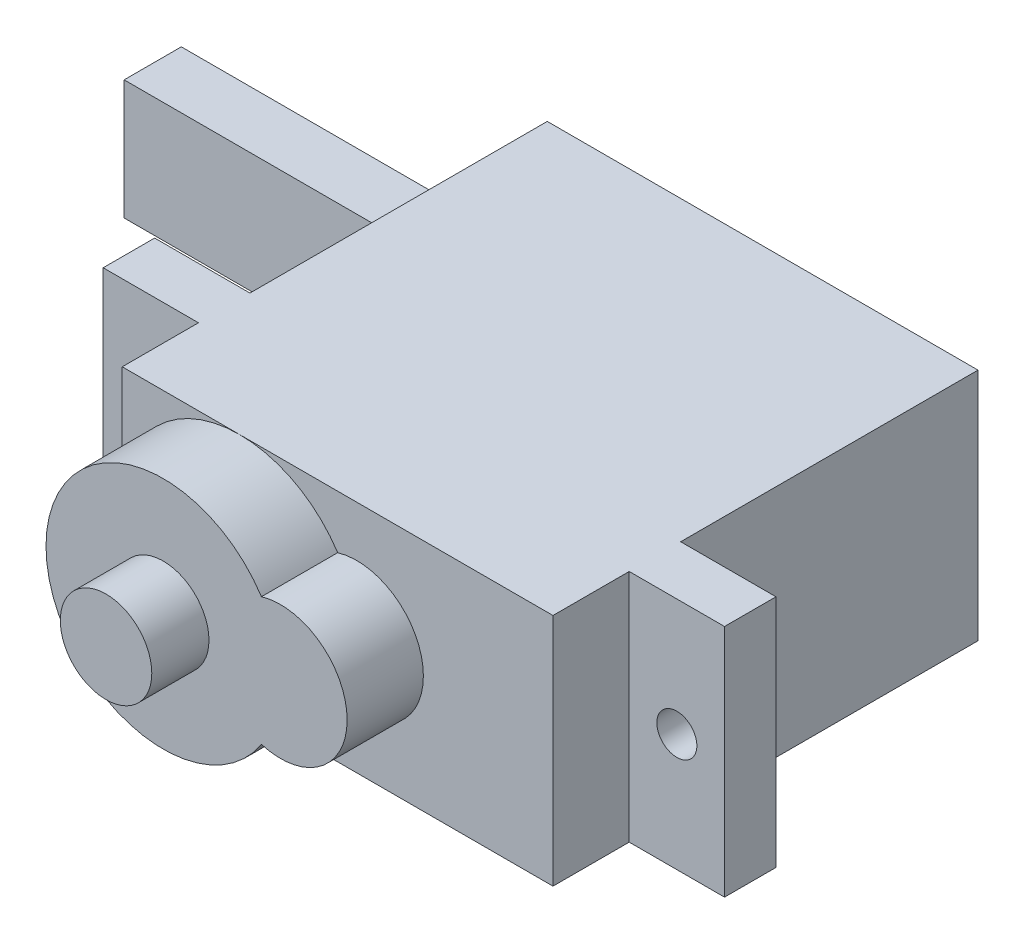
ISO-10303-21;
HEADER;
FILE_DESCRIPTION(('STEP AP214'),'2;1');
FILE_NAME('part.step','',(''),(''),'','','');
FILE_SCHEMA(('AUTOMOTIVE_DESIGN { 1 0 10303 214 1 1 1 1 }'));
ENDSEC;
DATA;
#1=APPLICATION_CONTEXT('core data for automotive mechanical design processes');
#2=APPLICATION_PROTOCOL_DEFINITION('international standard','automotive_design',2000,#1);
#3=PRODUCT_CONTEXT('',#1,'mechanical');
#4=PRODUCT('Part','Part','',(#3));
#5=PRODUCT_RELATED_PRODUCT_CATEGORY('part','',(#4));
#6=PRODUCT_DEFINITION_FORMATION('','',#4);
#7=PRODUCT_DEFINITION_CONTEXT('part definition',#1,'design');
#8=PRODUCT_DEFINITION('design','',#6,#7);
#9=PRODUCT_DEFINITION_SHAPE('','',#8);
#10=(LENGTH_UNIT() NAMED_UNIT(*) SI_UNIT(.MILLI.,.METRE.));
#11=(NAMED_UNIT(*) PLANE_ANGLE_UNIT() SI_UNIT($,.RADIAN.));
#12=(NAMED_UNIT(*) SI_UNIT($,.STERADIAN.) SOLID_ANGLE_UNIT());
#13=UNCERTAINTY_MEASURE_WITH_UNIT(LENGTH_MEASURE(1.E-05),#10,'distance_accuracy_value','');
#14=(GEOMETRIC_REPRESENTATION_CONTEXT(3) GLOBAL_UNCERTAINTY_ASSIGNED_CONTEXT((#13)) GLOBAL_UNIT_ASSIGNED_CONTEXT((#10,
#11,#12)) REPRESENTATION_CONTEXT('',''));
#15=CARTESIAN_POINT('',(0.,0.,0.));
#16=DIRECTION('',(0.,0.,1.));
#17=DIRECTION('',(1.,0.,0.));
#18=AXIS2_PLACEMENT_3D('',#15,#16,#17);
#19=CARTESIAN_POINT('',(0.,0.,22.3));
#20=DIRECTION('',(1.,0.,0.));
#21=DIRECTION('',(0.,1.,0.));
#22=AXIS2_PLACEMENT_3D('',#19,#20,#21);
#23=PLANE('',#22);
#24=DIRECTION('',(0.,0.,-1.));
#25=VECTOR('',#24,1.);
#26=CARTESIAN_POINT('',(0.,0.,22.3));
#27=LINE('',#26,#25);
#28=CARTESIAN_POINT('',(0.,0.,15.6));
#29=VERTEX_POINT('',#28);
#30=CARTESIAN_POINT('',(0.,0.,0.));
#31=VERTEX_POINT('',#30);
#32=EDGE_CURVE('E314',#29,#31,#27,.T.);
#33=ORIENTED_EDGE('',*,*,#32,.F.);
#34=DIRECTION('',(0.,1.,0.));
#35=VECTOR('',#34,1.);
#36=CARTESIAN_POINT('',(0.,0.,15.6));
#37=LINE('',#36,#35);
#38=CARTESIAN_POINT('',(0.,12.3,15.6));
#39=VERTEX_POINT('',#38);
#40=EDGE_CURVE('E275',#29,#39,#37,.T.);
#41=ORIENTED_EDGE('',*,*,#40,.T.);
#42=DIRECTION('',(0.,0.,-1.));
#43=VECTOR('',#42,1.);
#44=CARTESIAN_POINT('',(0.,12.3,22.3));
#45=LINE('',#44,#43);
#46=CARTESIAN_POINT('',(0.,12.3,0.));
#47=VERTEX_POINT('',#46);
#48=EDGE_CURVE('E293',#39,#47,#45,.T.);
#49=ORIENTED_EDGE('',*,*,#48,.T.);
#50=DIRECTION('',(0.,-1.,0.));
#51=VECTOR('',#50,1.);
#52=CARTESIAN_POINT('',(0.,0.,0.));
#53=LINE('',#52,#51);
#54=EDGE_CURVE('E278',#47,#31,#53,.T.);
#55=ORIENTED_EDGE('',*,*,#54,.T.);
#56=EDGE_LOOP('',(#33,#41,#49,#55));
#57=FACE_BOUND('',#56,.T.);
#58=DIRECTION('',(0.,-1.,0.));
#59=VECTOR('',#58,1.);
#60=CARTESIAN_POINT('',(0.,9.28888445746547,3.2));
#61=LINE('',#60,#59);
#62=CARTESIAN_POINT('',(0.,9.28888445746547,3.2));
#63=VERTEX_POINT('',#62);
#64=CARTESIAN_POINT('',(0.,3.01111554253453,3.2));
#65=VERTEX_POINT('',#64);
#66=EDGE_CURVE('E190',#63,#65,#61,.T.);
#67=ORIENTED_EDGE('',*,*,#66,.F.);
#68=DIRECTION('',(0.,0.,-1.));
#69=VECTOR('',#68,1.);
#70=CARTESIAN_POINT('',(0.,9.28888445746547,6.2));
#71=LINE('',#70,#69);
#72=CARTESIAN_POINT('',(0.,9.28888445746547,6.2));
#73=VERTEX_POINT('',#72);
#74=EDGE_CURVE('E187',#73,#63,#71,.T.);
#75=ORIENTED_EDGE('',*,*,#74,.F.);
#76=DIRECTION('',(0.,1.,0.));
#77=VECTOR('',#76,1.);
#78=CARTESIAN_POINT('',(0.,9.28888445746547,6.2));
#79=LINE('',#78,#77);
#80=CARTESIAN_POINT('',(0.,3.01111554253452,6.2));
#81=VERTEX_POINT('',#80);
#82=EDGE_CURVE('E56',#81,#73,#79,.T.);
#83=ORIENTED_EDGE('',*,*,#82,.F.);
#84=DIRECTION('',(0.,0.,1.));
#85=VECTOR('',#84,1.);
#86=CARTESIAN_POINT('',(0.,3.01111554253453,6.2));
#87=LINE('',#86,#85);
#88=EDGE_CURVE('E51',#65,#81,#87,.T.);
#89=ORIENTED_EDGE('',*,*,#88,.F.);
#90=EDGE_LOOP('',(#67,#75,#83,#89));
#91=FACE_BOUND('',#90,.T.);
#92=ADVANCED_FACE('F33',(#57,#91),#23,.F.);
#93=CARTESIAN_POINT('',(9.225,6.15,26.3));
#94=DIRECTION('',(0.,0.,1.));
#95=DIRECTION('',(1.,0.,0.));
#96=AXIS2_PLACEMENT_3D('',#93,#94,#95);
#97=PLANE('',#96);
#98=CARTESIAN_POINT('',(12.3,6.15,26.3));
#99=DIRECTION('',(0.,0.,1.));
#100=DIRECTION('',(1.,0.,0.));
#101=AXIS2_PLACEMENT_3D('',#98,#99,#100);
#102=CIRCLE('',#101,3.5);
#103=CARTESIAN_POINT('',(11.3040650406504,2.79468875411754,26.3));
#104=VERTEX_POINT('',#103);
#105=CARTESIAN_POINT('',(11.3040650406504,9.50531124588246,26.3));
#106=VERTEX_POINT('',#105);
#107=EDGE_CURVE('E203',#104,#106,#102,.T.);
#108=ORIENTED_EDGE('',*,*,#107,.T.);
#109=CARTESIAN_POINT('',(6.15,6.15,26.3));
#110=DIRECTION('',(0.,0.,1.));
#111=DIRECTION('',(1.,0.,0.));
#112=AXIS2_PLACEMENT_3D('',#109,#110,#111);
#113=CIRCLE('',#112,6.15);
#114=EDGE_CURVE('E206',#106,#104,#113,.T.);
#115=ORIENTED_EDGE('',*,*,#114,.T.);
#116=EDGE_LOOP('',(#108,#115));
#117=FACE_BOUND('',#116,.T.);
#118=CARTESIAN_POINT('',(6.15,6.15,26.3));
#119=DIRECTION('',(0.,0.,1.));
#120=DIRECTION('',(1.,0.,0.));
#121=AXIS2_PLACEMENT_3D('',#118,#119,#120);
#122=CIRCLE('',#121,2.4);
#123=CARTESIAN_POINT('',(8.55,6.15,26.3));
#124=VERTEX_POINT('',#123);
#125=EDGE_CURVE('E191',#124,#124,#122,.T.);
#126=ORIENTED_EDGE('',*,*,#125,.F.);
#127=EDGE_LOOP('',(#126));
#128=FACE_BOUND('',#127,.T.);
#129=ADVANCED_FACE('F394',(#117,#128),#97,.T.);
#130=CARTESIAN_POINT('',(0.,0.,22.3));
#131=DIRECTION('',(0.,0.,-1.));
#132=DIRECTION('',(-1.,0.,0.));
#133=AXIS2_PLACEMENT_3D('',#130,#131,#132);
#134=PLANE('',#133);
#135=CARTESIAN_POINT('',(12.3,6.15,22.3));
#136=DIRECTION('',(0.,0.,1.));
#137=DIRECTION('',(1.,0.,0.));
#138=AXIS2_PLACEMENT_3D('',#135,#136,#137);
#139=CIRCLE('',#138,3.5);
#140=CARTESIAN_POINT('',(11.3040650406504,2.79468875411754,22.3));
#141=VERTEX_POINT('',#140);
#142=CARTESIAN_POINT('',(11.3040650406504,9.50531124588246,22.3));
#143=VERTEX_POINT('',#142);
#144=EDGE_CURVE('E201',#141,#143,#139,.T.);
#145=ORIENTED_EDGE('',*,*,#144,.F.);
#146=CARTESIAN_POINT('',(6.15,6.15,22.3));
#147=DIRECTION('',(0.,0.,1.));
#148=DIRECTION('',(1.,0.,0.));
#149=AXIS2_PLACEMENT_3D('',#146,#147,#148);
#150=CIRCLE('',#149,6.15);
#151=CARTESIAN_POINT('',(6.15,0.,22.3));
#152=VERTEX_POINT('',#151);
#153=EDGE_CURVE('E212',#152,#141,#150,.T.);
#154=ORIENTED_EDGE('',*,*,#153,.F.);
#155=DIRECTION('',(1.,0.,0.));
#156=VECTOR('',#155,1.);
#157=CARTESIAN_POINT('',(0.,0.,22.3));
#158=LINE('',#157,#156);
#159=CARTESIAN_POINT('',(22.6,0.,22.3));
#160=VERTEX_POINT('',#159);
#161=EDGE_CURVE('E282',#152,#160,#158,.T.);
#162=ORIENTED_EDGE('',*,*,#161,.T.);
#163=DIRECTION('',(0.,1.,0.));
#164=VECTOR('',#163,1.);
#165=CARTESIAN_POINT('',(22.6,0.,22.3));
#166=LINE('',#165,#164);
#167=CARTESIAN_POINT('',(22.6,12.3,22.3));
#168=VERTEX_POINT('',#167);
#169=EDGE_CURVE('E287',#160,#168,#166,.T.);
#170=ORIENTED_EDGE('',*,*,#169,.T.);
#171=DIRECTION('',(-1.,0.,0.));
#172=VECTOR('',#171,1.);
#173=CARTESIAN_POINT('',(0.,12.3,22.3));
#174=LINE('',#173,#172);
#175=CARTESIAN_POINT('',(6.15,12.3,22.3));
#176=VERTEX_POINT('',#175);
#177=EDGE_CURVE('E290',#168,#176,#174,.T.);
#178=ORIENTED_EDGE('',*,*,#177,.T.);
#179=EDGE_CURVE('E44',#143,#176,#150,.T.);
#180=ORIENTED_EDGE('',*,*,#179,.F.);
#181=EDGE_LOOP('',(#145,#154,#162,#170,#178,#180));
#182=FACE_BOUND('',#181,.T.);
#183=ADVANCED_FACE('F356',(#182),#134,.F.);
#184=CARTESIAN_POINT('',(0.,6.15,22.3));
#185=VERTEX_POINT('',#184);
#186=EDGE_CURVE('E11',#176,#185,#150,.T.);
#187=ORIENTED_EDGE('',*,*,#186,.F.);
#188=CARTESIAN_POINT('',(0.,12.3,22.3));
#189=VERTEX_POINT('',#188);
#190=EDGE_CURVE('E289',#176,#189,#174,.T.);
#191=ORIENTED_EDGE('',*,*,#190,.T.);
#192=DIRECTION('',(0.,-1.,0.));
#193=VECTOR('',#192,1.);
#194=CARTESIAN_POINT('',(0.,0.,22.3));
#195=LINE('',#194,#193);
#196=EDGE_CURVE('E279',#189,#185,#195,.T.);
#197=ORIENTED_EDGE('',*,*,#196,.T.);
#198=EDGE_LOOP('',(#187,#191,#197));
#199=FACE_BOUND('',#198,.T.);
#200=ADVANCED_FACE('F366',(#199),#134,.F.);
#201=EDGE_CURVE('E42',#185,#152,#150,.T.);
#202=ORIENTED_EDGE('',*,*,#201,.F.);
#203=CARTESIAN_POINT('',(0.,0.,22.3));
#204=VERTEX_POINT('',#203);
#205=EDGE_CURVE('E283',#185,#204,#195,.T.);
#206=ORIENTED_EDGE('',*,*,#205,.T.);
#207=EDGE_CURVE('E284',#204,#152,#158,.T.);
#208=ORIENTED_EDGE('',*,*,#207,.T.);
#209=EDGE_LOOP('',(#202,#206,#208));
#210=FACE_BOUND('',#209,.T.);
#211=ADVANCED_FACE('F359',(#210),#134,.F.);
#212=CARTESIAN_POINT('',(22.6,0.,22.3));
#213=DIRECTION('',(-1.,0.,0.));
#214=DIRECTION('',(0.,-1.,0.));
#215=AXIS2_PLACEMENT_3D('',#212,#213,#214);
#216=PLANE('',#215);
#217=DIRECTION('',(0.,0.,-1.));
#218=VECTOR('',#217,1.);
#219=CARTESIAN_POINT('',(22.6,12.3,22.3));
#220=LINE('',#219,#218);
#221=CARTESIAN_POINT('',(22.6,12.3,15.6));
#222=VERTEX_POINT('',#221);
#223=CARTESIAN_POINT('',(22.6,12.3,0.));
#224=VERTEX_POINT('',#223);
#225=EDGE_CURVE('E307',#222,#224,#220,.T.);
#226=ORIENTED_EDGE('',*,*,#225,.F.);
#227=DIRECTION('',(0.,-1.,0.));
#228=VECTOR('',#227,1.);
#229=CARTESIAN_POINT('',(22.6,0.,15.6));
#230=LINE('',#229,#228);
#231=CARTESIAN_POINT('',(22.6,0.,15.6));
#232=VERTEX_POINT('',#231);
#233=EDGE_CURVE('E272',#222,#232,#230,.T.);
#234=ORIENTED_EDGE('',*,*,#233,.T.);
#235=DIRECTION('',(0.,0.,-1.));
#236=VECTOR('',#235,1.);
#237=CARTESIAN_POINT('',(22.6,0.,22.3));
#238=LINE('',#237,#236);
#239=CARTESIAN_POINT('',(22.6,0.,0.));
#240=VERTEX_POINT('',#239);
#241=EDGE_CURVE('E311',#232,#240,#238,.T.);
#242=ORIENTED_EDGE('',*,*,#241,.T.);
#243=DIRECTION('',(0.,1.,0.));
#244=VECTOR('',#243,1.);
#245=CARTESIAN_POINT('',(22.6,0.,0.));
#246=LINE('',#245,#244);
#247=EDGE_CURVE('E299',#240,#224,#246,.T.);
#248=ORIENTED_EDGE('',*,*,#247,.T.);
#249=EDGE_LOOP('',(#226,#234,#242,#248));
#250=FACE_BOUND('',#249,.T.);
#251=ADVANCED_FACE('F337',(#250),#216,.F.);
#252=CARTESIAN_POINT('',(0.,12.3,18.3));
#253=VERTEX_POINT('',#252);
#254=EDGE_CURVE('E305',#189,#253,#45,.T.);
#255=ORIENTED_EDGE('',*,*,#254,.T.);
#256=DIRECTION('',(0.,-1.,0.));
#257=VECTOR('',#256,1.);
#258=CARTESIAN_POINT('',(0.,0.,18.3));
#259=LINE('',#258,#257);
#260=CARTESIAN_POINT('',(0.,0.,18.3));
#261=VERTEX_POINT('',#260);
#262=EDGE_CURVE('E270',#253,#261,#259,.T.);
#263=ORIENTED_EDGE('',*,*,#262,.T.);
#264=EDGE_CURVE('E315',#204,#261,#27,.T.);
#265=ORIENTED_EDGE('',*,*,#264,.F.);
#266=ORIENTED_EDGE('',*,*,#205,.F.);
#267=ORIENTED_EDGE('',*,*,#196,.F.);
#268=EDGE_LOOP('',(#255,#263,#265,#266,#267));
#269=FACE_BOUND('',#268,.T.);
#270=ADVANCED_FACE('F35',(#269),#23,.F.);
#271=CARTESIAN_POINT('',(0.,0.,22.3));
#272=DIRECTION('',(0.,1.,0.));
#273=DIRECTION('',(0.,0.,1.));
#274=AXIS2_PLACEMENT_3D('',#271,#272,#273);
#275=PLANE('',#274);
#276=ORIENTED_EDGE('',*,*,#264,.T.);
#277=DIRECTION('',(1.,0.,0.));
#278=VECTOR('',#277,1.);
#279=CARTESIAN_POINT('',(-5.,0.,18.3));
#280=LINE('',#279,#278);
#281=CARTESIAN_POINT('',(-5.,0.,18.3));
#282=VERTEX_POINT('',#281);
#283=EDGE_CURVE('E257',#282,#261,#280,.T.);
#284=ORIENTED_EDGE('',*,*,#283,.F.);
#285=DIRECTION('',(0.,0.,-1.));
#286=VECTOR('',#285,1.);
#287=CARTESIAN_POINT('',(-5.,0.,18.3));
#288=LINE('',#287,#286);
#289=CARTESIAN_POINT('',(-5.,0.,15.6));
#290=VERTEX_POINT('',#289);
#291=EDGE_CURVE('E248',#282,#290,#288,.T.);
#292=ORIENTED_EDGE('',*,*,#291,.T.);
#293=DIRECTION('',(1.,0.,0.));
#294=VECTOR('',#293,1.);
#295=CARTESIAN_POINT('',(-5.,0.,15.6));
#296=LINE('',#295,#294);
#297=EDGE_CURVE('E252',#290,#29,#296,.T.);
#298=ORIENTED_EDGE('',*,*,#297,.T.);
#299=ORIENTED_EDGE('',*,*,#32,.T.);
#300=DIRECTION('',(1.,0.,0.));
#301=VECTOR('',#300,1.);
#302=CARTESIAN_POINT('',(0.,0.,0.));
#303=LINE('',#302,#301);
#304=EDGE_CURVE('E296',#31,#240,#303,.T.);
#305=ORIENTED_EDGE('',*,*,#304,.T.);
#306=ORIENTED_EDGE('',*,*,#241,.F.);
#307=CARTESIAN_POINT('',(27.6,0.,15.6));
#308=VERTEX_POINT('',#307);
#309=EDGE_CURVE('E256',#232,#308,#296,.T.);
#310=ORIENTED_EDGE('',*,*,#309,.T.);
#311=DIRECTION('',(0.,0.,-1.));
#312=VECTOR('',#311,1.);
#313=CARTESIAN_POINT('',(27.6,0.,18.3));
#314=LINE('',#313,#312);
#315=CARTESIAN_POINT('',(27.6,0.,18.3));
#316=VERTEX_POINT('',#315);
#317=EDGE_CURVE('E236',#316,#308,#314,.T.);
#318=ORIENTED_EDGE('',*,*,#317,.F.);
#319=CARTESIAN_POINT('',(22.6,0.,18.3));
#320=VERTEX_POINT('',#319);
#321=EDGE_CURVE('E260',#320,#316,#280,.T.);
#322=ORIENTED_EDGE('',*,*,#321,.F.);
#323=EDGE_CURVE('E312',#160,#320,#238,.T.);
#324=ORIENTED_EDGE('',*,*,#323,.F.);
#325=ORIENTED_EDGE('',*,*,#161,.F.);
#326=ORIENTED_EDGE('',*,*,#207,.F.);
#327=EDGE_LOOP('',(#276,#284,#292,#298,#299,#305,#306,#310,#318,#322,#324,#325,#326));
#328=FACE_BOUND('',#327,.T.);
#329=ADVANCED_FACE('F322',(#328),#275,.F.);
#330=ORIENTED_EDGE('',*,*,#323,.T.);
#331=DIRECTION('',(0.,1.,0.));
#332=VECTOR('',#331,1.);
#333=CARTESIAN_POINT('',(22.6,0.,18.3));
#334=LINE('',#333,#332);
#335=CARTESIAN_POINT('',(22.6,12.3,18.3));
#336=VERTEX_POINT('',#335);
#337=EDGE_CURVE('E255',#320,#336,#334,.T.);
#338=ORIENTED_EDGE('',*,*,#337,.T.);
#339=EDGE_CURVE('E308',#168,#336,#220,.T.);
#340=ORIENTED_EDGE('',*,*,#339,.F.);
#341=ORIENTED_EDGE('',*,*,#169,.F.);
#342=EDGE_LOOP('',(#330,#338,#340,#341));
#343=FACE_BOUND('',#342,.T.);
#344=ADVANCED_FACE('F352',(#343),#216,.F.);
#345=CARTESIAN_POINT('',(0.,12.3,22.3));
#346=DIRECTION('',(0.,-1.,0.));
#347=DIRECTION('',(0.,0.,-1.));
#348=AXIS2_PLACEMENT_3D('',#345,#346,#347);
#349=PLANE('',#348);
#350=ORIENTED_EDGE('',*,*,#339,.T.);
#351=DIRECTION('',(1.,0.,0.));
#352=VECTOR('',#351,1.);
#353=CARTESIAN_POINT('',(-5.,12.3,18.3));
#354=LINE('',#353,#352);
#355=CARTESIAN_POINT('',(27.6,12.3,18.3));
#356=VERTEX_POINT('',#355);
#357=EDGE_CURVE('E264',#336,#356,#354,.T.);
#358=ORIENTED_EDGE('',*,*,#357,.T.);
#359=DIRECTION('',(0.,0.,1.));
#360=VECTOR('',#359,1.);
#361=CARTESIAN_POINT('',(27.6,12.3,18.3));
#362=LINE('',#361,#360);
#363=CARTESIAN_POINT('',(27.6,12.3,15.6));
#364=VERTEX_POINT('',#363);
#365=EDGE_CURVE('E230',#364,#356,#362,.T.);
#366=ORIENTED_EDGE('',*,*,#365,.F.);
#367=DIRECTION('',(1.,0.,0.));
#368=VECTOR('',#367,1.);
#369=CARTESIAN_POINT('',(-5.,12.3,15.6));
#370=LINE('',#369,#368);
#371=EDGE_CURVE('E251',#222,#364,#370,.T.);
#372=ORIENTED_EDGE('',*,*,#371,.F.);
#373=ORIENTED_EDGE('',*,*,#225,.T.);
#374=DIRECTION('',(-1.,0.,0.));
#375=VECTOR('',#374,1.);
#376=CARTESIAN_POINT('',(0.,12.3,0.));
#377=LINE('',#376,#375);
#378=EDGE_CURVE('E302',#224,#47,#377,.T.);
#379=ORIENTED_EDGE('',*,*,#378,.T.);
#380=ORIENTED_EDGE('',*,*,#48,.F.);
#381=CARTESIAN_POINT('',(-5.,12.3,15.6));
#382=VERTEX_POINT('',#381);
#383=EDGE_CURVE('E265',#382,#39,#370,.T.);
#384=ORIENTED_EDGE('',*,*,#383,.F.);
#385=DIRECTION('',(0.,0.,1.));
#386=VECTOR('',#385,1.);
#387=CARTESIAN_POINT('',(-5.,12.3,18.3));
#388=LINE('',#387,#386);
#389=CARTESIAN_POINT('',(-5.,12.3,18.3));
#390=VERTEX_POINT('',#389);
#391=EDGE_CURVE('E242',#382,#390,#388,.T.);
#392=ORIENTED_EDGE('',*,*,#391,.T.);
#393=EDGE_CURVE('E261',#390,#253,#354,.T.);
#394=ORIENTED_EDGE('',*,*,#393,.T.);
#395=ORIENTED_EDGE('',*,*,#254,.F.);
#396=ORIENTED_EDGE('',*,*,#190,.F.);
#397=ORIENTED_EDGE('',*,*,#177,.F.);
#398=EDGE_LOOP('',(#350,#358,#366,#372,#373,#379,#380,#384,#392,#394,#395,#396,#397));
#399=FACE_BOUND('',#398,.T.);
#400=ADVANCED_FACE('F332',(#399),#349,.F.);
#401=CARTESIAN_POINT('',(0.,0.,0.));
#402=DIRECTION('',(0.,0.,-1.));
#403=DIRECTION('',(-1.,0.,0.));
#404=AXIS2_PLACEMENT_3D('',#401,#402,#403);
#405=PLANE('',#404);
#406=ORIENTED_EDGE('',*,*,#54,.F.);
#407=ORIENTED_EDGE('',*,*,#378,.F.);
#408=ORIENTED_EDGE('',*,*,#247,.F.);
#409=ORIENTED_EDGE('',*,*,#304,.F.);
#410=EDGE_LOOP('',(#406,#407,#408,#409));
#411=FACE_BOUND('',#410,.T.);
#412=ADVANCED_FACE('F329',(#411),#405,.T.);
#413=CARTESIAN_POINT('',(27.6,0.,0.));
#414=DIRECTION('',(-1.,0.,0.));
#415=DIRECTION('',(0.,-1.,0.));
#416=AXIS2_PLACEMENT_3D('',#413,#414,#415);
#417=PLANE('',#416);
#418=DIRECTION('',(0.,1.,0.));
#419=VECTOR('',#418,1.);
#420=CARTESIAN_POINT('',(27.6,0.,15.6));
#421=LINE('',#420,#419);
#422=EDGE_CURVE('E227',#308,#364,#421,.T.);
#423=ORIENTED_EDGE('',*,*,#422,.T.);
#424=ORIENTED_EDGE('',*,*,#365,.T.);
#425=DIRECTION('',(0.,-1.,0.));
#426=VECTOR('',#425,1.);
#427=CARTESIAN_POINT('',(27.6,0.,18.3));
#428=LINE('',#427,#426);
#429=EDGE_CURVE('E233',#356,#316,#428,.T.);
#430=ORIENTED_EDGE('',*,*,#429,.T.);
#431=ORIENTED_EDGE('',*,*,#317,.T.);
#432=EDGE_LOOP('',(#423,#424,#430,#431));
#433=FACE_BOUND('',#432,.T.);
#434=ADVANCED_FACE('F343',(#433),#417,.F.);
#435=CARTESIAN_POINT('',(-5.,0.,18.3));
#436=DIRECTION('',(0.,0.,1.));
#437=DIRECTION('',(0.,-1.,0.));
#438=AXIS2_PLACEMENT_3D('',#435,#436,#437);
#439=PLANE('',#438);
#440=CARTESIAN_POINT('',(25.1,6.15,18.3));
#441=DIRECTION('',(0.,0.,1.));
#442=DIRECTION('',(-1.,0.,0.));
#443=AXIS2_PLACEMENT_3D('',#440,#441,#442);
#444=CIRCLE('',#443,1.05);
#445=CARTESIAN_POINT('',(24.05,6.15,18.3));
#446=VERTEX_POINT('',#445);
#447=EDGE_CURVE('E218',#446,#446,#444,.T.);
#448=ORIENTED_EDGE('',*,*,#447,.F.);
#449=EDGE_LOOP('',(#448));
#450=FACE_BOUND('',#449,.T.);
#451=ORIENTED_EDGE('',*,*,#337,.F.);
#452=ORIENTED_EDGE('',*,*,#321,.T.);
#453=ORIENTED_EDGE('',*,*,#429,.F.);
#454=ORIENTED_EDGE('',*,*,#357,.F.);
#455=EDGE_LOOP('',(#451,#452,#453,#454));
#456=FACE_BOUND('',#455,.T.);
#457=ADVANCED_FACE('F347',(#450,#456),#439,.T.);
#458=CARTESIAN_POINT('',(-5.,0.,15.6));
#459=DIRECTION('',(0.,0.,-1.));
#460=DIRECTION('',(0.,1.,0.));
#461=AXIS2_PLACEMENT_3D('',#458,#459,#460);
#462=PLANE('',#461);
#463=CARTESIAN_POINT('',(25.1,6.15,15.6));
#464=DIRECTION('',(0.,0.,-1.));
#465=DIRECTION('',(0.,1.,0.));
#466=AXIS2_PLACEMENT_3D('',#463,#464,#465);
#467=CIRCLE('',#466,1.05);
#468=CARTESIAN_POINT('',(25.1,7.2,15.6));
#469=VERTEX_POINT('',#468);
#470=EDGE_CURVE('E37',#469,#469,#467,.T.);
#471=ORIENTED_EDGE('',*,*,#470,.F.);
#472=EDGE_LOOP('',(#471));
#473=FACE_BOUND('',#472,.T.);
#474=ORIENTED_EDGE('',*,*,#233,.F.);
#475=ORIENTED_EDGE('',*,*,#371,.T.);
#476=ORIENTED_EDGE('',*,*,#422,.F.);
#477=ORIENTED_EDGE('',*,*,#309,.F.);
#478=EDGE_LOOP('',(#474,#475,#476,#477));
#479=FACE_BOUND('',#478,.T.);
#480=ADVANCED_FACE('F345',(#473,#479),#462,.T.);
#481=CARTESIAN_POINT('',(-2.5,6.15,15.6));
#482=DIRECTION('',(0.,0.,-1.));
#483=DIRECTION('',(0.,1.,0.));
#484=AXIS2_PLACEMENT_3D('',#481,#482,#483);
#485=CIRCLE('',#484,1.05);
#486=CARTESIAN_POINT('',(-2.5,7.2,15.6));
#487=VERTEX_POINT('',#486);
#488=EDGE_CURVE('E224',#487,#487,#485,.T.);
#489=ORIENTED_EDGE('',*,*,#488,.F.);
#490=EDGE_LOOP('',(#489));
#491=FACE_BOUND('',#490,.T.);
#492=ORIENTED_EDGE('',*,*,#40,.F.);
#493=ORIENTED_EDGE('',*,*,#297,.F.);
#494=DIRECTION('',(0.,1.,0.));
#495=VECTOR('',#494,1.);
#496=CARTESIAN_POINT('',(-5.,0.,15.6));
#497=LINE('',#496,#495);
#498=EDGE_CURVE('E239',#290,#382,#497,.T.);
#499=ORIENTED_EDGE('',*,*,#498,.T.);
#500=ORIENTED_EDGE('',*,*,#383,.T.);
#501=EDGE_LOOP('',(#492,#493,#499,#500));
#502=FACE_BOUND('',#501,.T.);
#503=ADVANCED_FACE('F380',(#491,#502),#462,.T.);
#504=CARTESIAN_POINT('',(-2.5,6.15,18.3));
#505=DIRECTION('',(0.,0.,1.));
#506=DIRECTION('',(1.,0.,0.));
#507=AXIS2_PLACEMENT_3D('',#504,#505,#506);
#508=CIRCLE('',#507,1.05);
#509=CARTESIAN_POINT('',(-1.45,6.15,18.3));
#510=VERTEX_POINT('',#509);
#511=EDGE_CURVE('E221',#510,#510,#508,.T.);
#512=ORIENTED_EDGE('',*,*,#511,.F.);
#513=EDGE_LOOP('',(#512));
#514=FACE_BOUND('',#513,.T.);
#515=ORIENTED_EDGE('',*,*,#262,.F.);
#516=ORIENTED_EDGE('',*,*,#393,.F.);
#517=DIRECTION('',(0.,-1.,0.));
#518=VECTOR('',#517,1.);
#519=CARTESIAN_POINT('',(-5.,0.,18.3));
#520=LINE('',#519,#518);
#521=EDGE_CURVE('E245',#390,#282,#520,.T.);
#522=ORIENTED_EDGE('',*,*,#521,.T.);
#523=ORIENTED_EDGE('',*,*,#283,.T.);
#524=EDGE_LOOP('',(#515,#516,#522,#523));
#525=FACE_BOUND('',#524,.T.);
#526=ADVANCED_FACE('F372',(#514,#525),#439,.T.);
#527=CARTESIAN_POINT('',(-5.,0.,0.));
#528=DIRECTION('',(-1.,0.,0.));
#529=DIRECTION('',(0.,-1.,0.));
#530=AXIS2_PLACEMENT_3D('',#527,#528,#529);
#531=PLANE('',#530);
#532=ORIENTED_EDGE('',*,*,#498,.F.);
#533=ORIENTED_EDGE('',*,*,#291,.F.);
#534=ORIENTED_EDGE('',*,*,#521,.F.);
#535=ORIENTED_EDGE('',*,*,#391,.F.);
#536=EDGE_LOOP('',(#532,#533,#534,#535));
#537=FACE_BOUND('',#536,.T.);
#538=ADVANCED_FACE('F377',(#537),#531,.T.);
#539=CARTESIAN_POINT('',(-2.5,6.15,13.3));
#540=DIRECTION('',(0.,0.,1.));
#541=DIRECTION('',(1.,0.,0.));
#542=AXIS2_PLACEMENT_3D('',#539,#540,#541);
#543=CYLINDRICAL_SURFACE('',#542,1.05);
#544=ORIENTED_EDGE('',*,*,#488,.T.);
#545=EDGE_LOOP('',(#544));
#546=FACE_BOUND('',#545,.T.);
#547=ORIENTED_EDGE('',*,*,#511,.T.);
#548=EDGE_LOOP('',(#547));
#549=FACE_BOUND('',#548,.T.);
#550=ADVANCED_FACE('F548',(#546,#549),#543,.F.);
#551=CARTESIAN_POINT('',(25.1,6.15,13.3));
#552=DIRECTION('',(0.,0.,1.));
#553=DIRECTION('',(1.,0.,0.));
#554=AXIS2_PLACEMENT_3D('',#551,#552,#553);
#555=CYLINDRICAL_SURFACE('',#554,1.05);
#556=ORIENTED_EDGE('',*,*,#470,.T.);
#557=EDGE_LOOP('',(#556));
#558=FACE_BOUND('',#557,.T.);
#559=ORIENTED_EDGE('',*,*,#447,.T.);
#560=EDGE_LOOP('',(#559));
#561=FACE_BOUND('',#560,.T.);
#562=ADVANCED_FACE('F457',(#558,#561),#555,.F.);
#563=CARTESIAN_POINT('',(12.3,6.15,26.3));
#564=DIRECTION('',(0.,0.,-1.));
#565=DIRECTION('',(-1.,0.,0.));
#566=AXIS2_PLACEMENT_3D('',#563,#564,#565);
#567=CYLINDRICAL_SURFACE('',#566,3.5);
#568=ORIENTED_EDGE('',*,*,#144,.T.);
#569=DIRECTION('',(0.,0.,-1.));
#570=VECTOR('',#569,1.);
#571=CARTESIAN_POINT('',(11.3040650406504,9.50531124588246,26.3));
#572=LINE('',#571,#570);
#573=EDGE_CURVE('E215',#106,#143,#572,.T.);
#574=ORIENTED_EDGE('',*,*,#573,.F.);
#575=ORIENTED_EDGE('',*,*,#107,.F.);
#576=DIRECTION('',(0.,0.,-1.));
#577=VECTOR('',#576,1.);
#578=CARTESIAN_POINT('',(11.3040650406504,2.79468875411754,26.3));
#579=LINE('',#578,#577);
#580=EDGE_CURVE('E208',#104,#141,#579,.T.);
#581=ORIENTED_EDGE('',*,*,#580,.T.);
#582=EDGE_LOOP('',(#568,#574,#575,#581));
#583=FACE_BOUND('',#582,.T.);
#584=ADVANCED_FACE('F452',(#583),#567,.T.);
#585=CARTESIAN_POINT('',(6.15,6.15,26.3));
#586=DIRECTION('',(0.,0.,-1.));
#587=DIRECTION('',(-1.,0.,0.));
#588=AXIS2_PLACEMENT_3D('',#585,#586,#587);
#589=CYLINDRICAL_SURFACE('',#588,6.15);
#590=ORIENTED_EDGE('',*,*,#179,.T.);
#591=ORIENTED_EDGE('',*,*,#186,.T.);
#592=ORIENTED_EDGE('',*,*,#201,.T.);
#593=ORIENTED_EDGE('',*,*,#153,.T.);
#594=ORIENTED_EDGE('',*,*,#580,.F.);
#595=ORIENTED_EDGE('',*,*,#114,.F.);
#596=ORIENTED_EDGE('',*,*,#573,.T.);
#597=EDGE_LOOP('',(#590,#591,#592,#593,#594,#595,#596));
#598=FACE_BOUND('',#597,.T.);
#599=ADVANCED_FACE('F362',(#598),#589,.T.);
#600=CARTESIAN_POINT('',(6.15,6.15,29.3));
#601=DIRECTION('',(0.,0.,-1.));
#602=DIRECTION('',(-1.,0.,0.));
#603=AXIS2_PLACEMENT_3D('',#600,#601,#602);
#604=CYLINDRICAL_SURFACE('',#603,2.4);
#605=CARTESIAN_POINT('',(6.15,6.15,29.3));
#606=DIRECTION('',(0.,0.,1.));
#607=DIRECTION('',(1.,0.,0.));
#608=AXIS2_PLACEMENT_3D('',#605,#606,#607);
#609=CIRCLE('',#608,2.4);
#610=CARTESIAN_POINT('',(8.55,6.15,29.3));
#611=VERTEX_POINT('',#610);
#612=EDGE_CURVE('E194',#611,#611,#609,.T.);
#613=ORIENTED_EDGE('',*,*,#612,.F.);
#614=EDGE_LOOP('',(#613));
#615=FACE_BOUND('',#614,.T.);
#616=ORIENTED_EDGE('',*,*,#125,.T.);
#617=EDGE_LOOP('',(#616));
#618=FACE_BOUND('',#617,.T.);
#619=ADVANCED_FACE('F469',(#615,#618),#604,.T.);
#620=CARTESIAN_POINT('',(6.15,6.15,29.3));
#621=DIRECTION('',(0.,0.,1.));
#622=DIRECTION('',(1.,0.,0.));
#623=AXIS2_PLACEMENT_3D('',#620,#621,#622);
#624=PLANE('',#623);
#625=ORIENTED_EDGE('',*,*,#612,.T.);
#626=EDGE_LOOP('',(#625));
#627=FACE_BOUND('',#626,.T.);
#628=ADVANCED_FACE('F484',(#627),#624,.T.);
#629=CARTESIAN_POINT('',(-16.,9.28888445746546,3.2));
#630=DIRECTION('',(0.,0.,1.));
#631=DIRECTION('',(1.,0.,0.));
#632=AXIS2_PLACEMENT_3D('',#629,#630,#631);
#633=PLANE('',#632);
#634=ORIENTED_EDGE('',*,*,#66,.T.);
#635=DIRECTION('',(1.,0.,0.));
#636=VECTOR('',#635,1.);
#637=CARTESIAN_POINT('',(-16.,3.01111554253452,3.2));
#638=LINE('',#637,#636);
#639=CARTESIAN_POINT('',(-16.,3.01111554253452,3.2));
#640=VERTEX_POINT('',#639);
#641=EDGE_CURVE('E171',#640,#65,#638,.T.);
#642=ORIENTED_EDGE('',*,*,#641,.F.);
#643=DIRECTION('',(0.,-1.,0.));
#644=VECTOR('',#643,1.);
#645=CARTESIAN_POINT('',(-16.,9.28888445746546,3.2));
#646=LINE('',#645,#644);
#647=CARTESIAN_POINT('',(-16.,9.28888445746546,3.2));
#648=VERTEX_POINT('',#647);
#649=EDGE_CURVE('E178',#648,#640,#646,.T.);
#650=ORIENTED_EDGE('',*,*,#649,.F.);
#651=DIRECTION('',(1.,0.,0.));
#652=VECTOR('',#651,1.);
#653=CARTESIAN_POINT('',(-16.,9.28888445746546,3.2));
#654=LINE('',#653,#652);
#655=EDGE_CURVE('E632',#648,#63,#654,.T.);
#656=ORIENTED_EDGE('',*,*,#655,.T.);
#657=EDGE_LOOP('',(#634,#642,#650,#656));
#658=FACE_BOUND('',#657,.T.);
#659=ADVANCED_FACE('F189',(#658),#633,.F.);
#660=CARTESIAN_POINT('',(-16.,3.01111554253452,6.2));
#661=DIRECTION('',(0.,1.,0.));
#662=DIRECTION('',(-1.,0.,0.));
#663=AXIS2_PLACEMENT_3D('',#660,#661,#662);
#664=PLANE('',#663);
#665=ORIENTED_EDGE('',*,*,#88,.T.);
#666=DIRECTION('',(1.,0.,0.));
#667=VECTOR('',#666,1.);
#668=CARTESIAN_POINT('',(-16.,3.01111554253452,6.2));
#669=LINE('',#668,#667);
#670=CARTESIAN_POINT('',(-16.,3.01111554253452,6.2));
#671=VERTEX_POINT('',#670);
#672=EDGE_CURVE('E174',#671,#81,#669,.T.);
#673=ORIENTED_EDGE('',*,*,#672,.F.);
#674=DIRECTION('',(0.,0.,1.));
#675=VECTOR('',#674,1.);
#676=CARTESIAN_POINT('',(-16.,3.01111554253452,6.2));
#677=LINE('',#676,#675);
#678=EDGE_CURVE('E167',#640,#671,#677,.T.);
#679=ORIENTED_EDGE('',*,*,#678,.F.);
#680=ORIENTED_EDGE('',*,*,#641,.T.);
#681=EDGE_LOOP('',(#665,#673,#679,#680));
#682=FACE_BOUND('',#681,.T.);
#683=ADVANCED_FACE('F169',(#682),#664,.F.);
#684=CARTESIAN_POINT('',(-16.,9.28888445746546,6.2));
#685=DIRECTION('',(0.,0.,-1.));
#686=DIRECTION('',(-1.,0.,0.));
#687=AXIS2_PLACEMENT_3D('',#684,#685,#686);
#688=PLANE('',#687);
#689=ORIENTED_EDGE('',*,*,#82,.T.);
#690=DIRECTION('',(1.,0.,0.));
#691=VECTOR('',#690,1.);
#692=CARTESIAN_POINT('',(-16.,9.28888445746546,6.2));
#693=LINE('',#692,#691);
#694=CARTESIAN_POINT('',(-16.,9.28888445746546,6.2));
#695=VERTEX_POINT('',#694);
#696=EDGE_CURVE('E196',#695,#73,#693,.T.);
#697=ORIENTED_EDGE('',*,*,#696,.F.);
#698=DIRECTION('',(0.,1.,0.));
#699=VECTOR('',#698,1.);
#700=CARTESIAN_POINT('',(-16.,9.28888445746546,6.2));
#701=LINE('',#700,#699);
#702=EDGE_CURVE('E177',#671,#695,#701,.T.);
#703=ORIENTED_EDGE('',*,*,#702,.F.);
#704=ORIENTED_EDGE('',*,*,#672,.T.);
#705=EDGE_LOOP('',(#689,#697,#703,#704));
#706=FACE_BOUND('',#705,.T.);
#707=ADVANCED_FACE('F515',(#706),#688,.F.);
#708=CARTESIAN_POINT('',(-16.,9.28888445746546,6.2));
#709=DIRECTION('',(0.,-1.,0.));
#710=DIRECTION('',(1.,0.,0.));
#711=AXIS2_PLACEMENT_3D('',#708,#709,#710);
#712=PLANE('',#711);
#713=ORIENTED_EDGE('',*,*,#74,.T.);
#714=ORIENTED_EDGE('',*,*,#655,.F.);
#715=DIRECTION('',(0.,0.,-1.));
#716=VECTOR('',#715,1.);
#717=CARTESIAN_POINT('',(-16.,9.28888445746546,6.2));
#718=LINE('',#717,#716);
#719=EDGE_CURVE('E183',#695,#648,#718,.T.);
#720=ORIENTED_EDGE('',*,*,#719,.F.);
#721=ORIENTED_EDGE('',*,*,#696,.T.);
#722=EDGE_LOOP('',(#713,#714,#720,#721));
#723=FACE_BOUND('',#722,.T.);
#724=ADVANCED_FACE('F524',(#723),#712,.F.);
#725=CARTESIAN_POINT('',(-16.,0.,0.));
#726=DIRECTION('',(1.,0.,0.));
#727=DIRECTION('',(0.,1.,0.));
#728=AXIS2_PLACEMENT_3D('',#725,#726,#727);
#729=PLANE('',#728);
#730=ORIENTED_EDGE('',*,*,#649,.T.);
#731=ORIENTED_EDGE('',*,*,#678,.T.);
#732=ORIENTED_EDGE('',*,*,#702,.T.);
#733=ORIENTED_EDGE('',*,*,#719,.T.);
#734=EDGE_LOOP('',(#730,#731,#732,#733));
#735=FACE_BOUND('',#734,.T.);
#736=ADVANCED_FACE('F181',(#735),#729,.F.);
#737=CLOSED_SHELL('',(#92,#129,#183,#200,#211,#251,#270,#329,#344,#400,#412,#434,#457,#480,#503,
#526,#538,#550,#562,#584,#599,#619,#628,#659,#683,#707,#724,#736));
#738=MANIFOLD_SOLID_BREP('B2',#737);
#739=ADVANCED_BREP_SHAPE_REPRESENTATION('',(#18,#738),#14);
#740=SHAPE_DEFINITION_REPRESENTATION(#9,#739);
ENDSEC;
END-ISO-10303-21;
